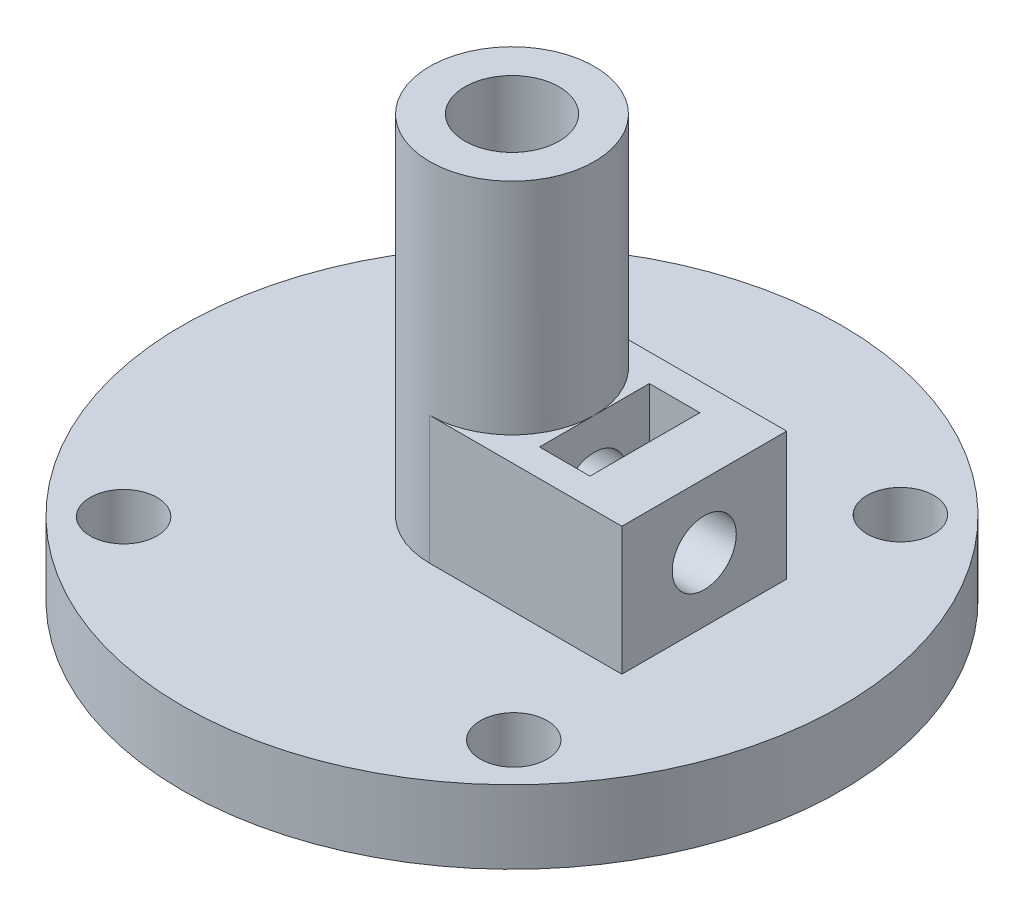
ISO-10303-21;
HEADER;
FILE_DESCRIPTION(('STEP AP214'),'2;1');
FILE_NAME('part.step','',(''),(''),'','','');
FILE_SCHEMA(('AUTOMOTIVE_DESIGN { 1 0 10303 214 1 1 1 1 }'));
ENDSEC;
DATA;
#1=APPLICATION_CONTEXT('core data for automotive mechanical design processes');
#2=APPLICATION_PROTOCOL_DEFINITION('international standard','automotive_design',2000,#1);
#3=PRODUCT_CONTEXT('',#1,'mechanical');
#4=PRODUCT('Part','Part','',(#3));
#5=PRODUCT_RELATED_PRODUCT_CATEGORY('part','',(#4));
#6=PRODUCT_DEFINITION_FORMATION('','',#4);
#7=PRODUCT_DEFINITION_CONTEXT('part definition',#1,'design');
#8=PRODUCT_DEFINITION('design','',#6,#7);
#9=PRODUCT_DEFINITION_SHAPE('','',#8);
#10=(LENGTH_UNIT() NAMED_UNIT(*) SI_UNIT(.MILLI.,.METRE.));
#11=(NAMED_UNIT(*) PLANE_ANGLE_UNIT() SI_UNIT($,.RADIAN.));
#12=(NAMED_UNIT(*) SI_UNIT($,.STERADIAN.) SOLID_ANGLE_UNIT());
#13=UNCERTAINTY_MEASURE_WITH_UNIT(LENGTH_MEASURE(1.E-05),#10,'distance_accuracy_value','');
#14=(GEOMETRIC_REPRESENTATION_CONTEXT(3) GLOBAL_UNCERTAINTY_ASSIGNED_CONTEXT((#13)) GLOBAL_UNIT_ASSIGNED_CONTEXT((#10,
#11,#12)) REPRESENTATION_CONTEXT('',''));
#15=CARTESIAN_POINT('',(0.,0.,0.));
#16=DIRECTION('',(0.,0.,1.));
#17=DIRECTION('',(1.,0.,0.));
#18=AXIS2_PLACEMENT_3D('',#15,#16,#17);
#19=CARTESIAN_POINT('',(0.,4.,0.));
#20=DIRECTION('',(0.,1.,0.));
#21=DIRECTION('',(0.,0.,1.));
#22=AXIS2_PLACEMENT_3D('',#19,#20,#21);
#23=PLANE('',#22);
#24=DIRECTION('',(0.,0.,1.));
#25=VECTOR('',#24,1.);
#26=CARTESIAN_POINT('',(10.5,4.,0.));
#27=LINE('',#26,#25);
#28=CARTESIAN_POINT('',(10.5,4.,-4.5));
#29=VERTEX_POINT('',#28);
#30=CARTESIAN_POINT('',(10.5,4.,4.5));
#31=VERTEX_POINT('',#30);
#32=EDGE_CURVE('E142',#29,#31,#27,.T.);
#33=ORIENTED_EDGE('',*,*,#32,.T.);
#34=DIRECTION('',(1.,0.,0.));
#35=VECTOR('',#34,1.);
#36=CARTESIAN_POINT('',(0.,4.,4.5));
#37=LINE('',#36,#35);
#38=CARTESIAN_POINT('',(0.,4.,4.5));
#39=VERTEX_POINT('',#38);
#40=EDGE_CURVE('E50',#39,#31,#37,.T.);
#41=ORIENTED_EDGE('',*,*,#40,.F.);
#42=CARTESIAN_POINT('',(0.,4.,0.));
#43=DIRECTION('',(0.,1.,0.));
#44=DIRECTION('',(0.,0.,1.));
#45=AXIS2_PLACEMENT_3D('',#42,#43,#44);
#46=CIRCLE('',#45,4.5);
#47=CARTESIAN_POINT('',(0.,4.,-4.5));
#48=VERTEX_POINT('',#47);
#49=EDGE_CURVE('E179',#48,#39,#46,.T.);
#50=ORIENTED_EDGE('',*,*,#49,.F.);
#51=DIRECTION('',(1.,0.,0.));
#52=VECTOR('',#51,1.);
#53=CARTESIAN_POINT('',(0.,4.,-4.5));
#54=LINE('',#53,#52);
#55=EDGE_CURVE('E57',#48,#29,#54,.T.);
#56=ORIENTED_EDGE('',*,*,#55,.T.);
#57=EDGE_LOOP('',(#33,#41,#50,#56));
#58=FACE_BOUND('',#57,.T.);
#59=CARTESIAN_POINT('',(-10.5589795718644,4.,10.6540110006021));
#60=DIRECTION('',(0.,1.,0.));
#61=DIRECTION('',(0.,0.,1.));
#62=AXIS2_PLACEMENT_3D('',#59,#60,#61);
#63=CIRCLE('',#62,1.825);
#64=CARTESIAN_POINT('',(-10.5589795718644,4.,12.4790110006021));
#65=VERTEX_POINT('',#64);
#66=EDGE_CURVE('E186',#65,#65,#63,.T.);
#67=ORIENTED_EDGE('',*,*,#66,.F.);
#68=EDGE_LOOP('',(#67));
#69=FACE_BOUND('',#68,.T.);
#70=CARTESIAN_POINT('',(10.6540110006025,4.,10.5589795718648));
#71=DIRECTION('',(0.,1.,0.));
#72=DIRECTION('',(0.,0.,1.));
#73=AXIS2_PLACEMENT_3D('',#70,#71,#72);
#74=CIRCLE('',#73,1.825);
#75=CARTESIAN_POINT('',(10.6540110006025,4.,12.3839795718648));
#76=VERTEX_POINT('',#75);
#77=EDGE_CURVE('E202',#76,#76,#74,.T.);
#78=ORIENTED_EDGE('',*,*,#77,.F.);
#79=EDGE_LOOP('',(#78));
#80=FACE_BOUND('',#79,.T.);
#81=CARTESIAN_POINT('',(10.5589795718652,4.,-10.6540110006021));
#82=DIRECTION('',(0.,1.,0.));
#83=DIRECTION('',(0.,0.,1.));
#84=AXIS2_PLACEMENT_3D('',#81,#82,#83);
#85=CIRCLE('',#84,1.825);
#86=CARTESIAN_POINT('',(10.5589795718652,4.,-8.8290110006021));
#87=VERTEX_POINT('',#86);
#88=EDGE_CURVE('E196',#87,#87,#85,.T.);
#89=ORIENTED_EDGE('',*,*,#88,.F.);
#90=EDGE_LOOP('',(#89));
#91=FACE_BOUND('',#90,.T.);
#92=CARTESIAN_POINT('',(-10.6540110006017,4.,-10.5589795718648));
#93=DIRECTION('',(0.,1.,0.));
#94=DIRECTION('',(0.,0.,1.));
#95=AXIS2_PLACEMENT_3D('',#92,#93,#94);
#96=CIRCLE('',#95,1.825);
#97=CARTESIAN_POINT('',(-10.6540110006017,4.,-8.73397957186481));
#98=VERTEX_POINT('',#97);
#99=EDGE_CURVE('E192',#98,#98,#96,.T.);
#100=ORIENTED_EDGE('',*,*,#99,.F.);
#101=EDGE_LOOP('',(#100));
#102=FACE_BOUND('',#101,.T.);
#103=CARTESIAN_POINT('',(0.,4.,0.));
#104=DIRECTION('',(0.,1.,0.));
#105=DIRECTION('',(0.,0.,1.));
#106=AXIS2_PLACEMENT_3D('',#103,#104,#105);
#107=CIRCLE('',#106,18.);
#108=CARTESIAN_POINT('',(0.,4.,18.));
#109=VERTEX_POINT('',#108);
#110=EDGE_CURVE('E11',#109,#109,#107,.T.);
#111=ORIENTED_EDGE('',*,*,#110,.T.);
#112=EDGE_LOOP('',(#111));
#113=FACE_BOUND('',#112,.T.);
#114=ADVANCED_FACE('F35',(#58,#69,#80,#91,#102,#113),#23,.T.);
#115=CARTESIAN_POINT('',(4.5,11.,0.));
#116=DIRECTION('',(-1.,0.,0.));
#117=DIRECTION('',(0.,0.,1.));
#118=AXIS2_PLACEMENT_3D('',#115,#116,#117);
#119=PLANE('',#118);
#120=CARTESIAN_POINT('',(4.5,7.5,0.));
#121=DIRECTION('',(-1.,0.,0.));
#122=DIRECTION('',(0.,0.,1.));
#123=AXIS2_PLACEMENT_3D('',#120,#121,#122);
#124=CIRCLE('',#123,1.75);
#125=CARTESIAN_POINT('',(4.5,7.5,1.75));
#126=VERTEX_POINT('',#125);
#127=EDGE_CURVE('E140',#126,#126,#124,.T.);
#128=ORIENTED_EDGE('',*,*,#127,.T.);
#129=EDGE_LOOP('',(#128));
#130=FACE_BOUND('',#129,.T.);
#131=DIRECTION('',(0.,0.,1.));
#132=VECTOR('',#131,1.);
#133=CARTESIAN_POINT('',(4.5,11.,0.));
#134=LINE('',#133,#132);
#135=CARTESIAN_POINT('',(4.5,11.,0.));
#136=VERTEX_POINT('',#135);
#137=CARTESIAN_POINT('',(4.5,11.,3.));
#138=VERTEX_POINT('',#137);
#139=EDGE_CURVE('E158',#136,#138,#134,.T.);
#140=ORIENTED_EDGE('',*,*,#139,.T.);
#141=DIRECTION('',(0.,-1.,0.));
#142=VECTOR('',#141,1.);
#143=CARTESIAN_POINT('',(4.5,11.,3.));
#144=LINE('',#143,#142);
#145=CARTESIAN_POINT('',(4.5,4.,3.));
#146=VERTEX_POINT('',#145);
#147=EDGE_CURVE('E115',#138,#146,#144,.T.);
#148=ORIENTED_EDGE('',*,*,#147,.T.);
#149=DIRECTION('',(0.,0.,-1.));
#150=VECTOR('',#149,1.);
#151=CARTESIAN_POINT('',(4.5,4.,0.));
#152=LINE('',#151,#150);
#153=CARTESIAN_POINT('',(4.5,4.,-3.));
#154=VERTEX_POINT('',#153);
#155=EDGE_CURVE('E163',#146,#154,#152,.T.);
#156=ORIENTED_EDGE('',*,*,#155,.T.);
#157=DIRECTION('',(0.,-1.,0.));
#158=VECTOR('',#157,1.);
#159=CARTESIAN_POINT('',(4.5,11.,-3.));
#160=LINE('',#159,#158);
#161=CARTESIAN_POINT('',(4.5,11.,-3.));
#162=VERTEX_POINT('',#161);
#163=EDGE_CURVE('E147',#162,#154,#160,.T.);
#164=ORIENTED_EDGE('',*,*,#163,.F.);
#165=DIRECTION('',(0.,0.,-1.));
#166=VECTOR('',#165,1.);
#167=CARTESIAN_POINT('',(4.5,11.,0.));
#168=LINE('',#167,#166);
#169=EDGE_CURVE('E169',#136,#162,#168,.T.);
#170=ORIENTED_EDGE('',*,*,#169,.F.);
#171=EDGE_LOOP('',(#140,#148,#156,#164,#170));
#172=FACE_BOUND('',#171,.T.);
#173=ADVANCED_FACE('F220',(#130,#172),#119,.F.);
#174=DIRECTION('',(1.,0.,0.));
#175=VECTOR('',#174,1.);
#176=CARTESIAN_POINT('',(0.,4.,3.));
#177=LINE('',#176,#175);
#178=CARTESIAN_POINT('',(7.26,4.,3.));
#179=VERTEX_POINT('',#178);
#180=EDGE_CURVE('E139',#146,#179,#177,.T.);
#181=ORIENTED_EDGE('',*,*,#180,.T.);
#182=DIRECTION('',(0.,0.,-1.));
#183=VECTOR('',#182,1.);
#184=CARTESIAN_POINT('',(7.26,4.,0.));
#185=LINE('',#184,#183);
#186=CARTESIAN_POINT('',(7.26,4.,-3.));
#187=VERTEX_POINT('',#186);
#188=EDGE_CURVE('E110',#179,#187,#185,.T.);
#189=ORIENTED_EDGE('',*,*,#188,.T.);
#190=DIRECTION('',(1.,0.,0.));
#191=VECTOR('',#190,1.);
#192=CARTESIAN_POINT('',(0.,4.,-3.));
#193=LINE('',#192,#191);
#194=EDGE_CURVE('E126',#154,#187,#193,.T.);
#195=ORIENTED_EDGE('',*,*,#194,.F.);
#196=ORIENTED_EDGE('',*,*,#155,.F.);
#197=EDGE_LOOP('',(#181,#189,#195,#196));
#198=FACE_BOUND('',#197,.T.);
#199=ADVANCED_FACE('F222',(#198),#23,.T.);
#200=CARTESIAN_POINT('',(0.,23.,0.));
#201=DIRECTION('',(0.,-1.,0.));
#202=DIRECTION('',(0.,0.,-1.));
#203=AXIS2_PLACEMENT_3D('',#200,#201,#202);
#204=CYLINDRICAL_SURFACE('',#203,4.5);
#205=CARTESIAN_POINT('',(0.,23.,0.));
#206=DIRECTION('',(0.,1.,0.));
#207=DIRECTION('',(0.,0.,1.));
#208=AXIS2_PLACEMENT_3D('',#205,#206,#207);
#209=CIRCLE('',#208,4.5);
#210=CARTESIAN_POINT('',(0.,23.,4.5));
#211=VERTEX_POINT('',#210);
#212=EDGE_CURVE('E183',#211,#211,#209,.T.);
#213=ORIENTED_EDGE('',*,*,#212,.F.);
#214=EDGE_LOOP('',(#213));
#215=FACE_BOUND('',#214,.T.);
#216=DIRECTION('',(0.,-1.,0.));
#217=VECTOR('',#216,1.);
#218=CARTESIAN_POINT('',(0.,11.,4.5));
#219=LINE('',#218,#217);
#220=CARTESIAN_POINT('',(0.,11.,4.5));
#221=VERTEX_POINT('',#220);
#222=EDGE_CURVE('E156',#221,#39,#219,.T.);
#223=ORIENTED_EDGE('',*,*,#222,.F.);
#224=CARTESIAN_POINT('',(0.,11.,0.));
#225=DIRECTION('',(0.,1.,0.));
#226=DIRECTION('',(0.,0.,1.));
#227=AXIS2_PLACEMENT_3D('',#224,#225,#226);
#228=CIRCLE('',#227,4.5);
#229=EDGE_CURVE('E114',#221,#136,#228,.T.);
#230=ORIENTED_EDGE('',*,*,#229,.T.);
#231=CARTESIAN_POINT('',(0.,11.,0.));
#232=DIRECTION('',(0.,1.,0.));
#233=DIRECTION('',(0.,0.,1.));
#234=AXIS2_PLACEMENT_3D('',#231,#232,#233);
#235=CIRCLE('',#234,4.5);
#236=CARTESIAN_POINT('',(0.,11.,-4.5));
#237=VERTEX_POINT('',#236);
#238=EDGE_CURVE('E166',#136,#237,#235,.T.);
#239=ORIENTED_EDGE('',*,*,#238,.T.);
#240=DIRECTION('',(0.,-1.,0.));
#241=VECTOR('',#240,1.);
#242=CARTESIAN_POINT('',(0.,11.,-4.5));
#243=LINE('',#242,#241);
#244=EDGE_CURVE('E173',#237,#48,#243,.T.);
#245=ORIENTED_EDGE('',*,*,#244,.T.);
#246=ORIENTED_EDGE('',*,*,#49,.T.);
#247=EDGE_LOOP('',(#223,#230,#239,#245,#246));
#248=FACE_BOUND('',#247,.T.);
#249=ADVANCED_FACE('F228',(#215,#248),#204,.T.);
#250=CARTESIAN_POINT('',(0.,4.,0.));
#251=DIRECTION('',(0.,-1.,0.));
#252=DIRECTION('',(0.,0.,-1.));
#253=AXIS2_PLACEMENT_3D('',#250,#251,#252);
#254=CYLINDRICAL_SURFACE('',#253,18.);
#255=ORIENTED_EDGE('',*,*,#110,.F.);
#256=EDGE_LOOP('',(#255));
#257=FACE_BOUND('',#256,.T.);
#258=CARTESIAN_POINT('',(0.,0.,0.));
#259=DIRECTION('',(0.,1.,0.));
#260=DIRECTION('',(0.,0.,1.));
#261=AXIS2_PLACEMENT_3D('',#258,#259,#260);
#262=CIRCLE('',#261,18.);
#263=CARTESIAN_POINT('',(0.,0.,18.));
#264=VERTEX_POINT('',#263);
#265=EDGE_CURVE('E39',#264,#264,#262,.T.);
#266=ORIENTED_EDGE('',*,*,#265,.T.);
#267=EDGE_LOOP('',(#266));
#268=FACE_BOUND('',#267,.T.);
#269=ADVANCED_FACE('F37',(#257,#268),#254,.T.);
#270=CARTESIAN_POINT('',(0.,0.,0.));
#271=DIRECTION('',(0.,1.,0.));
#272=DIRECTION('',(0.,0.,1.));
#273=AXIS2_PLACEMENT_3D('',#270,#271,#272);
#274=PLANE('',#273);
#275=CARTESIAN_POINT('',(-10.5589795718644,0.,10.6540110006021));
#276=DIRECTION('',(0.,1.,0.));
#277=DIRECTION('',(0.,0.,1.));
#278=AXIS2_PLACEMENT_3D('',#275,#276,#277);
#279=CIRCLE('',#278,1.825);
#280=CARTESIAN_POINT('',(-10.5589795718644,0.,12.4790110006021));
#281=VERTEX_POINT('',#280);
#282=EDGE_CURVE('E205',#281,#281,#279,.T.);
#283=ORIENTED_EDGE('',*,*,#282,.T.);
#284=EDGE_LOOP('',(#283));
#285=FACE_BOUND('',#284,.T.);
#286=CARTESIAN_POINT('',(10.6540110006025,0.,10.5589795718648));
#287=DIRECTION('',(0.,1.,0.));
#288=DIRECTION('',(0.,0.,1.));
#289=AXIS2_PLACEMENT_3D('',#286,#287,#288);
#290=CIRCLE('',#289,1.825);
#291=CARTESIAN_POINT('',(10.6540110006025,0.,12.3839795718648));
#292=VERTEX_POINT('',#291);
#293=EDGE_CURVE('E199',#292,#292,#290,.T.);
#294=ORIENTED_EDGE('',*,*,#293,.T.);
#295=EDGE_LOOP('',(#294));
#296=FACE_BOUND('',#295,.T.);
#297=CARTESIAN_POINT('',(10.5589795718652,0.,-10.6540110006021));
#298=DIRECTION('',(0.,1.,0.));
#299=DIRECTION('',(0.,0.,1.));
#300=AXIS2_PLACEMENT_3D('',#297,#298,#299);
#301=CIRCLE('',#300,1.825);
#302=CARTESIAN_POINT('',(10.5589795718652,0.,-8.8290110006021));
#303=VERTEX_POINT('',#302);
#304=EDGE_CURVE('E193',#303,#303,#301,.T.);
#305=ORIENTED_EDGE('',*,*,#304,.T.);
#306=EDGE_LOOP('',(#305));
#307=FACE_BOUND('',#306,.T.);
#308=CARTESIAN_POINT('',(0.,0.,0.));
#309=DIRECTION('',(0.,1.,0.));
#310=DIRECTION('',(0.,0.,1.));
#311=AXIS2_PLACEMENT_3D('',#308,#309,#310);
#312=CIRCLE('',#311,2.575);
#313=CARTESIAN_POINT('',(0.,0.,2.575));
#314=VERTEX_POINT('',#313);
#315=EDGE_CURVE('E189',#314,#314,#312,.T.);
#316=ORIENTED_EDGE('',*,*,#315,.T.);
#317=EDGE_LOOP('',(#316));
#318=FACE_BOUND('',#317,.T.);
#319=CARTESIAN_POINT('',(-10.6540110006017,0.,-10.5589795718648));
#320=DIRECTION('',(0.,1.,0.));
#321=DIRECTION('',(0.,0.,1.));
#322=AXIS2_PLACEMENT_3D('',#319,#320,#321);
#323=CIRCLE('',#322,1.825);
#324=CARTESIAN_POINT('',(-10.6540110006017,0.,-8.73397957186481));
#325=VERTEX_POINT('',#324);
#326=EDGE_CURVE('E210',#325,#325,#323,.T.);
#327=ORIENTED_EDGE('',*,*,#326,.T.);
#328=EDGE_LOOP('',(#327));
#329=FACE_BOUND('',#328,.T.);
#330=ORIENTED_EDGE('',*,*,#265,.F.);
#331=EDGE_LOOP('',(#330));
#332=FACE_BOUND('',#331,.T.);
#333=ADVANCED_FACE('F227',(#285,#296,#307,#318,#329,#332),#274,.F.);
#334=CARTESIAN_POINT('',(-10.6540110006017,0.,-10.5589795718648));
#335=DIRECTION('',(0.,1.,0.));
#336=DIRECTION('',(0.,0.,1.));
#337=AXIS2_PLACEMENT_3D('',#334,#335,#336);
#338=CYLINDRICAL_SURFACE('',#337,1.825);
#339=ORIENTED_EDGE('',*,*,#326,.F.);
#340=EDGE_LOOP('',(#339));
#341=FACE_BOUND('',#340,.T.);
#342=ORIENTED_EDGE('',*,*,#99,.T.);
#343=EDGE_LOOP('',(#342));
#344=FACE_BOUND('',#343,.T.);
#345=ADVANCED_FACE('F216',(#341,#344),#338,.F.);
#346=CARTESIAN_POINT('',(0.,0.,0.));
#347=DIRECTION('',(0.,1.,0.));
#348=DIRECTION('',(0.,0.,1.));
#349=AXIS2_PLACEMENT_3D('',#346,#347,#348);
#350=CYLINDRICAL_SURFACE('',#349,2.575);
#351=CARTESIAN_POINT('',(1.88894811998636,7.5,-1.75));
#352=CARTESIAN_POINT('',(1.88896127570853,7.584856709678,-1.74999274712449));
#353=CARTESIAN_POINT('',(1.89477888166079,7.66976946907564,-1.74376974898489));
#354=CARTESIAN_POINT('',(1.9168907510481,7.83651666979239,-1.71941873924017));
#355=CARTESIAN_POINT('',(1.93320743625965,7.91834412530091,-1.70126524716065));
#356=CARTESIAN_POINT('',(1.9733405005138,8.07594806823087,-1.65453324831505));
#357=CARTESIAN_POINT('',(1.99707886738419,8.15177766017081,-1.62606271413772));
#358=CARTESIAN_POINT('',(2.04924455399824,8.2974404852297,-1.55980714654182));
#359=CARTESIAN_POINT('',(2.07767255931395,8.36727283934737,-1.52202075084982));
#360=CARTESIAN_POINT('',(2.14155837532086,8.51142517081065,-1.43105544934505));
#361=CARTESIAN_POINT('',(2.17740689420404,8.5846225102066,-1.37637172249015));
#362=CARTESIAN_POINT('',(2.24888431100404,8.721793285141,-1.25620233890706));
#363=CARTESIAN_POINT('',(2.28451291547509,8.78575621984911,-1.19070456361891));
#364=CARTESIAN_POINT('',(2.35793782984972,8.91237329510512,-1.0387109468412));
#365=CARTESIAN_POINT('',(2.39523234477831,8.97333125914173,-0.950535701983107));
#366=CARTESIAN_POINT('',(2.46162635761846,9.07897548573598,-0.762188368863097));
#367=CARTESIAN_POINT('',(2.49074110044598,9.12369206408719,-0.662039100547952));
#368=CARTESIAN_POINT('',(2.53120719222669,9.1850110747363,-0.479572167163504));
#369=CARTESIAN_POINT('',(2.54519882924399,9.2058818700441,-0.399263846904382));
#370=CARTESIAN_POINT('',(2.56552356965098,9.23606284661888,-0.235572030673899));
#371=CARTESIAN_POINT('',(2.57186256836913,9.24538192707683,-0.152190952947602));
#372=CARTESIAN_POINT('',(2.57632070848884,9.25194434472185,0.0154102051474283));
#373=CARTESIAN_POINT('',(2.57442587446601,9.24916715067774,0.0996314697265288));
#374=CARTESIAN_POINT('',(2.56256104346585,9.23165668774806,0.26624475011632));
#375=CARTESIAN_POINT('',(2.55258868045458,9.21691991571357,0.348636222686357));
#376=CARTESIAN_POINT('',(2.52569283826932,9.17666864533112,0.507844230373744));
#377=CARTESIAN_POINT('',(2.50890125261763,9.15135840043403,0.58473566358223));
#378=CARTESIAN_POINT('',(2.4696462771837,9.09108442961262,0.7330520646118));
#379=CARTESIAN_POINT('',(2.44718180958288,9.05611886910948,0.804475990270121));
#380=CARTESIAN_POINT('',(2.39527949085475,8.97322828222293,0.948559980378887));
#381=CARTESIAN_POINT('',(2.36534104332483,8.92428676848122,1.02045199645255));
#382=CARTESIAN_POINT('',(2.30239584567868,8.81711208344035,1.15549201950931));
#383=CARTESIAN_POINT('',(2.26938557752197,8.75886820244495,1.21862978939408));
#384=CARTESIAN_POINT('',(2.19692230409728,8.62346082621249,1.34549208520136));
#385=CARTESIAN_POINT('',(2.15732522028314,8.54476374369659,1.4075039790277));
#386=CARTESIAN_POINT('',(2.08121595493411,8.37688432484707,1.51777698381026));
#387=CARTESIAN_POINT('',(2.04470212456889,8.28770765449184,1.56604547750068));
#388=CARTESIAN_POINT('',(1.98760509897062,8.12206153196546,1.63756856713269));
#389=CARTESIAN_POINT('',(1.96529708607844,8.04758507129091,1.66403994764414));
#390=CARTESIAN_POINT('',(1.9281803995822,7.89404491452536,1.70691437435249));
#391=CARTESIAN_POINT('',(1.91335798942852,7.81498991980656,1.72333587453045));
#392=CARTESIAN_POINT('',(1.89346559078333,7.65341770961466,1.74517886665378));
#393=CARTESIAN_POINT('',(1.88847723711403,7.57087727515565,1.75050830087774));
#394=CARTESIAN_POINT('',(1.88949013421689,7.40593956634669,1.74941491844563));
#395=CARTESIAN_POINT('',(1.89549139665116,7.32354229214876,1.74299208931814));
#396=CARTESIAN_POINT('',(1.91605268559687,7.17104537515994,1.7203357726196));
#397=CARTESIAN_POINT('',(1.92956225407731,7.10061253208657,1.70530049859642));
#398=CARTESIAN_POINT('',(1.9625532429715,6.9634050739091,1.66722629456956));
#399=CARTESIAN_POINT('',(1.98204019331772,6.89663391409746,1.64417995053959));
#400=CARTESIAN_POINT('',(2.03485990499653,6.73816892749182,1.57874496034542));
#401=CARTESIAN_POINT('',(2.07046501351936,6.6488956441029,1.53232393574432));
#402=CARTESIAN_POINT('',(2.14519604857245,6.48046322579824,1.42583458734813));
#403=CARTESIAN_POINT('',(2.18432843497217,6.40132331789943,1.36574090365419));
#404=CARTESIAN_POINT('',(2.26251912955272,6.25305231163275,1.23195962940916));
#405=CARTESIAN_POINT('',(2.30156857049436,6.18407851600816,1.15809187985337));
#406=CARTESIAN_POINT('',(2.37524835106887,6.05909059832307,0.998266984746064));
#407=CARTESIAN_POINT('',(2.40988560783285,6.00305607595752,0.912329217895766));
#408=CARTESIAN_POINT('',(2.46590519309217,5.91459375130406,0.745816834566028));
#409=CARTESIAN_POINT('',(2.48854721211368,5.87974781278443,0.666954432357997));
#410=CARTESIAN_POINT('',(2.52670592122509,5.8217276704924,0.50340279127018));
#411=CARTESIAN_POINT('',(2.54222717494875,5.79854599027833,0.418717324474745));
#412=CARTESIAN_POINT('',(2.5647891964473,5.76501453923742,0.245273557746356));
#413=CARTESIAN_POINT('',(2.57178869394483,5.75472720781939,0.156497581474676));
#414=CARTESIAN_POINT('',(2.57645019518249,5.74786465774686,-0.0218263374083529));
#415=CARTESIAN_POINT('',(2.57411424087477,5.7512864404853,-0.111374106929155));
#416=CARTESIAN_POINT('',(2.56092385254528,5.7707662815715,-0.280968853841053));
#417=CARTESIAN_POINT('',(2.55077719938799,5.78577470731537,-0.361196482829984));
#418=CARTESIAN_POINT('',(2.52367195619799,5.82637431714804,-0.517703835369135));
#419=CARTESIAN_POINT('',(2.50671195072722,5.85196770023861,-0.593982734872278));
#420=CARTESIAN_POINT('',(2.46623654336057,5.91419276444817,-0.744784747292465));
#421=CARTESIAN_POINT('',(2.44243410110383,5.95131529236429,-0.819026134813643));
#422=CARTESIAN_POINT('',(2.39038976373503,6.03476923015158,-0.960387672767943));
#423=CARTESIAN_POINT('',(2.3621467531301,6.08110295469662,-1.02750602674431));
#424=CARTESIAN_POINT('',(2.29833253496022,6.18986577707146,-1.16396653367807));
#425=CARTESIAN_POINT('',(2.26230788897281,6.25368067250453,-1.23199218041617));
#426=CARTESIAN_POINT('',(2.18956416918921,6.39118348791672,-1.35708781722424));
#427=CARTESIAN_POINT('',(2.15284371580352,6.46489329016526,-1.41413282322837));
#428=CARTESIAN_POINT('',(2.07744705756071,6.63170071684409,-1.52307703585116));
#429=CARTESIAN_POINT('',(2.03914943792948,6.72607323101295,-1.57331107412348));
#430=CARTESIAN_POINT('',(1.97227577761427,6.92521126456407,-1.65638975046769));
#431=CARTESIAN_POINT('',(1.94365756265067,7.02992905928079,-1.68931018359428));
#432=CARTESIAN_POINT('',(1.91220959979604,7.19705873441822,-1.72463080306645));
#433=CARTESIAN_POINT('',(1.90357146941668,7.25692542552748,-1.73410341263547));
#434=CARTESIAN_POINT('',(1.89193738079909,7.37785212935583,-1.74678908333303));
#435=CARTESIAN_POINT('',(1.88893864916428,7.43891154057161,-1.75000522135483));
#436=CARTESIAN_POINT('',(1.88894811998636,7.5,-1.75));
#437=B_SPLINE_CURVE_WITH_KNOTS('',3,(#351,#352,#353,#354,#355,#356,#357,#358,#359,#360,#361,
#362,#363,#364,#365,#366,#367,#368,#369,#370,#371,#372,#373,#374,#375,#376,#377,#378,#379,#380,
#381,#382,#383,#384,#385,#386,#387,#388,#389,#390,#391,#392,#393,#394,#395,#396,#397,#398,#399,
#400,#401,#402,#403,#404,#405,#406,#407,#408,#409,#410,#411,#412,#413,#414,#415,#416,#417,#418,
#419,#420,#421,#422,#423,#424,#425,#426,#427,#428,#429,#430,#431,#432,#433,#434,#435,#436),
.UNSPECIFIED.,.T.,.F.,(4,2,2,2,2,2,2,2,2,2,2,2,2,2,2,2,2,2,2,2,2,2,2,2,2,2,2,2,2,2,2,2,2,2,2,2,
2,2,2,2,2,2,4),(0.,0.25428193094091,0.50910871547543,0.761342197866413,1.0136125866661,
1.30698571882204,1.60068987372349,1.93931138777842,2.27729755045081,2.52864968585983,
2.77980806444173,3.03139290477063,3.28305146487522,3.53005830107874,3.77711210267495,
4.05201194640325,4.32723059095945,4.6490739777443,4.9707441478263,5.21622597379684,
5.46125567331366,5.70831099757502,5.95536658401016,6.17433832141078,6.39351325309881,
6.71202658444316,7.03113557777311,7.35475559905378,7.67786185709077,7.94417780979689,
8.21032284377365,8.47775173729071,8.74512213903575,8.99076168127207,9.23645228024048,
9.49451197376029,9.75263659703981,10.0514403979889,10.3509162277952,10.6898037272679,
11.0271950379103,11.2103430358244,11.3934009399147),.UNSPECIFIED.);
#438=CARTESIAN_POINT('',(1.88894811998636,7.5,-1.75));
#439=VERTEX_POINT('',#438);
#440=EDGE_CURVE('E263',#439,#439,#437,.T.);
#441=ORIENTED_EDGE('',*,*,#440,.T.);
#442=EDGE_LOOP('',(#441));
#443=FACE_BOUND('',#442,.T.);
#444=ORIENTED_EDGE('',*,*,#315,.F.);
#445=EDGE_LOOP('',(#444));
#446=FACE_BOUND('',#445,.T.);
#447=CARTESIAN_POINT('',(0.,23.,0.));
#448=DIRECTION('',(0.,1.,0.));
#449=DIRECTION('',(0.,0.,1.));
#450=AXIS2_PLACEMENT_3D('',#447,#448,#449);
#451=CIRCLE('',#450,2.575);
#452=CARTESIAN_POINT('',(0.,23.,2.575));
#453=VERTEX_POINT('',#452);
#454=EDGE_CURVE('E180',#453,#453,#451,.F.);
#455=ORIENTED_EDGE('',*,*,#454,.F.);
#456=EDGE_LOOP('',(#455));
#457=FACE_BOUND('',#456,.T.);
#458=ADVANCED_FACE('F237',(#443,#446,#457),#350,.F.);
#459=CARTESIAN_POINT('',(10.5589795718652,0.,-10.6540110006021));
#460=DIRECTION('',(0.,1.,0.));
#461=DIRECTION('',(0.,0.,1.));
#462=AXIS2_PLACEMENT_3D('',#459,#460,#461);
#463=CYLINDRICAL_SURFACE('',#462,1.825);
#464=ORIENTED_EDGE('',*,*,#304,.F.);
#465=EDGE_LOOP('',(#464));
#466=FACE_BOUND('',#465,.T.);
#467=ORIENTED_EDGE('',*,*,#88,.T.);
#468=EDGE_LOOP('',(#467));
#469=FACE_BOUND('',#468,.T.);
#470=ADVANCED_FACE('F252',(#466,#469),#463,.F.);
#471=CARTESIAN_POINT('',(10.6540110006025,0.,10.5589795718648));
#472=DIRECTION('',(0.,1.,0.));
#473=DIRECTION('',(0.,0.,1.));
#474=AXIS2_PLACEMENT_3D('',#471,#472,#473);
#475=CYLINDRICAL_SURFACE('',#474,1.825);
#476=ORIENTED_EDGE('',*,*,#293,.F.);
#477=EDGE_LOOP('',(#476));
#478=FACE_BOUND('',#477,.T.);
#479=ORIENTED_EDGE('',*,*,#77,.T.);
#480=EDGE_LOOP('',(#479));
#481=FACE_BOUND('',#480,.T.);
#482=ADVANCED_FACE('F248',(#478,#481),#475,.F.);
#483=CARTESIAN_POINT('',(-10.5589795718644,0.,10.6540110006021));
#484=DIRECTION('',(0.,1.,0.));
#485=DIRECTION('',(0.,0.,1.));
#486=AXIS2_PLACEMENT_3D('',#483,#484,#485);
#487=CYLINDRICAL_SURFACE('',#486,1.825);
#488=ORIENTED_EDGE('',*,*,#282,.F.);
#489=EDGE_LOOP('',(#488));
#490=FACE_BOUND('',#489,.T.);
#491=ORIENTED_EDGE('',*,*,#66,.T.);
#492=EDGE_LOOP('',(#491));
#493=FACE_BOUND('',#492,.T.);
#494=ADVANCED_FACE('F244',(#490,#493),#487,.F.);
#495=CARTESIAN_POINT('',(0.,23.,0.));
#496=DIRECTION('',(0.,1.,0.));
#497=DIRECTION('',(0.,0.,1.));
#498=AXIS2_PLACEMENT_3D('',#495,#496,#497);
#499=PLANE('',#498);
#500=ORIENTED_EDGE('',*,*,#454,.T.);
#501=EDGE_LOOP('',(#500));
#502=FACE_BOUND('',#501,.T.);
#503=ORIENTED_EDGE('',*,*,#212,.T.);
#504=EDGE_LOOP('',(#503));
#505=FACE_BOUND('',#504,.T.);
#506=ADVANCED_FACE('F247',(#502,#505),#499,.T.);
#507=CARTESIAN_POINT('',(0.,11.,-4.5));
#508=DIRECTION('',(0.,0.,-1.));
#509=DIRECTION('',(-1.,0.,0.));
#510=AXIS2_PLACEMENT_3D('',#507,#508,#509);
#511=PLANE('',#510);
#512=ORIENTED_EDGE('',*,*,#55,.F.);
#513=ORIENTED_EDGE('',*,*,#244,.F.);
#514=DIRECTION('',(1.,0.,0.));
#515=VECTOR('',#514,1.);
#516=CARTESIAN_POINT('',(0.,11.,-4.5));
#517=LINE('',#516,#515);
#518=CARTESIAN_POINT('',(10.5,11.,-4.5));
#519=VERTEX_POINT('',#518);
#520=EDGE_CURVE('E171',#237,#519,#517,.T.);
#521=ORIENTED_EDGE('',*,*,#520,.T.);
#522=DIRECTION('',(0.,-1.,0.));
#523=VECTOR('',#522,1.);
#524=CARTESIAN_POINT('',(10.5,11.,-4.5));
#525=LINE('',#524,#523);
#526=EDGE_CURVE('E150',#519,#29,#525,.T.);
#527=ORIENTED_EDGE('',*,*,#526,.T.);
#528=EDGE_LOOP('',(#512,#513,#521,#527));
#529=FACE_BOUND('',#528,.T.);
#530=ADVANCED_FACE('F296',(#529),#511,.T.);
#531=CARTESIAN_POINT('',(0.,11.,0.));
#532=DIRECTION('',(0.,1.,0.));
#533=DIRECTION('',(0.,0.,1.));
#534=AXIS2_PLACEMENT_3D('',#531,#532,#533);
#535=PLANE('',#534);
#536=ORIENTED_EDGE('',*,*,#238,.F.);
#537=ORIENTED_EDGE('',*,*,#169,.T.);
#538=DIRECTION('',(1.,0.,0.));
#539=VECTOR('',#538,1.);
#540=CARTESIAN_POINT('',(0.,11.,-3.));
#541=LINE('',#540,#539);
#542=CARTESIAN_POINT('',(7.26,11.,-3.));
#543=VERTEX_POINT('',#542);
#544=EDGE_CURVE('E124',#162,#543,#541,.T.);
#545=ORIENTED_EDGE('',*,*,#544,.T.);
#546=DIRECTION('',(0.,0.,-1.));
#547=VECTOR('',#546,1.);
#548=CARTESIAN_POINT('',(7.26,11.,0.));
#549=LINE('',#548,#547);
#550=CARTESIAN_POINT('',(7.26,11.,3.));
#551=VERTEX_POINT('',#550);
#552=EDGE_CURVE('E109',#551,#543,#549,.T.);
#553=ORIENTED_EDGE('',*,*,#552,.F.);
#554=DIRECTION('',(1.,0.,0.));
#555=VECTOR('',#554,1.);
#556=CARTESIAN_POINT('',(0.,11.,3.));
#557=LINE('',#556,#555);
#558=EDGE_CURVE('E121',#138,#551,#557,.T.);
#559=ORIENTED_EDGE('',*,*,#558,.F.);
#560=ORIENTED_EDGE('',*,*,#139,.F.);
#561=ORIENTED_EDGE('',*,*,#229,.F.);
#562=DIRECTION('',(1.,0.,0.));
#563=VECTOR('',#562,1.);
#564=CARTESIAN_POINT('',(0.,11.,4.5));
#565=LINE('',#564,#563);
#566=CARTESIAN_POINT('',(10.5,11.,4.5));
#567=VERTEX_POINT('',#566);
#568=EDGE_CURVE('E161',#221,#567,#565,.T.);
#569=ORIENTED_EDGE('',*,*,#568,.T.);
#570=DIRECTION('',(0.,0.,1.));
#571=VECTOR('',#570,1.);
#572=CARTESIAN_POINT('',(10.5,11.,0.));
#573=LINE('',#572,#571);
#574=EDGE_CURVE('E130',#519,#567,#573,.T.);
#575=ORIENTED_EDGE('',*,*,#574,.F.);
#576=ORIENTED_EDGE('',*,*,#520,.F.);
#577=EDGE_LOOP('',(#536,#537,#545,#553,#559,#560,#561,#569,#575,#576));
#578=FACE_BOUND('',#577,.T.);
#579=ADVANCED_FACE('F120',(#578),#535,.T.);
#580=CARTESIAN_POINT('',(0.,11.,4.5));
#581=DIRECTION('',(0.,0.,-1.));
#582=DIRECTION('',(-1.,0.,0.));
#583=AXIS2_PLACEMENT_3D('',#580,#581,#582);
#584=PLANE('',#583);
#585=ORIENTED_EDGE('',*,*,#40,.T.);
#586=DIRECTION('',(0.,-1.,0.));
#587=VECTOR('',#586,1.);
#588=CARTESIAN_POINT('',(10.5,11.,4.5));
#589=LINE('',#588,#587);
#590=EDGE_CURVE('E152',#567,#31,#589,.T.);
#591=ORIENTED_EDGE('',*,*,#590,.F.);
#592=ORIENTED_EDGE('',*,*,#568,.F.);
#593=ORIENTED_EDGE('',*,*,#222,.T.);
#594=EDGE_LOOP('',(#585,#591,#592,#593));
#595=FACE_BOUND('',#594,.T.);
#596=ADVANCED_FACE('F290',(#595),#584,.F.);
#597=CARTESIAN_POINT('',(7.26,11.,0.));
#598=DIRECTION('',(-1.,0.,0.));
#599=DIRECTION('',(0.,0.,1.));
#600=AXIS2_PLACEMENT_3D('',#597,#598,#599);
#601=PLANE('',#600);
#602=CARTESIAN_POINT('',(7.26,7.5,0.));
#603=DIRECTION('',(-1.,0.,0.));
#604=DIRECTION('',(0.,0.,1.));
#605=AXIS2_PLACEMENT_3D('',#602,#603,#604);
#606=CIRCLE('',#605,1.75);
#607=CARTESIAN_POINT('',(7.26,7.5,1.75));
#608=VERTEX_POINT('',#607);
#609=EDGE_CURVE('E270',#608,#608,#606,.T.);
#610=ORIENTED_EDGE('',*,*,#609,.F.);
#611=EDGE_LOOP('',(#610));
#612=FACE_BOUND('',#611,.T.);
#613=ORIENTED_EDGE('',*,*,#188,.F.);
#614=DIRECTION('',(0.,-1.,0.));
#615=VECTOR('',#614,1.);
#616=CARTESIAN_POINT('',(7.26,11.,3.));
#617=LINE('',#616,#615);
#618=EDGE_CURVE('E105',#551,#179,#617,.T.);
#619=ORIENTED_EDGE('',*,*,#618,.F.);
#620=ORIENTED_EDGE('',*,*,#552,.T.);
#621=DIRECTION('',(0.,-1.,0.));
#622=VECTOR('',#621,1.);
#623=CARTESIAN_POINT('',(7.26,11.,-3.));
#624=LINE('',#623,#622);
#625=EDGE_CURVE('E137',#543,#187,#624,.T.);
#626=ORIENTED_EDGE('',*,*,#625,.T.);
#627=EDGE_LOOP('',(#613,#619,#620,#626));
#628=FACE_BOUND('',#627,.T.);
#629=ADVANCED_FACE('F107',(#612,#628),#601,.T.);
#630=CARTESIAN_POINT('',(0.,11.,3.));
#631=DIRECTION('',(0.,0.,-1.));
#632=DIRECTION('',(-1.,0.,0.));
#633=AXIS2_PLACEMENT_3D('',#630,#631,#632);
#634=PLANE('',#633);
#635=ORIENTED_EDGE('',*,*,#180,.F.);
#636=ORIENTED_EDGE('',*,*,#147,.F.);
#637=ORIENTED_EDGE('',*,*,#558,.T.);
#638=ORIENTED_EDGE('',*,*,#618,.T.);
#639=EDGE_LOOP('',(#635,#636,#637,#638));
#640=FACE_BOUND('',#639,.T.);
#641=ADVANCED_FACE('F129',(#640),#634,.T.);
#642=CARTESIAN_POINT('',(10.5,11.,0.));
#643=DIRECTION('',(1.,0.,0.));
#644=DIRECTION('',(0.,0.,-1.));
#645=AXIS2_PLACEMENT_3D('',#642,#643,#644);
#646=PLANE('',#645);
#647=CARTESIAN_POINT('',(10.5,7.5,0.));
#648=DIRECTION('',(1.,0.,0.));
#649=DIRECTION('',(0.,0.,-1.));
#650=AXIS2_PLACEMENT_3D('',#647,#648,#649);
#651=CIRCLE('',#650,1.75);
#652=CARTESIAN_POINT('',(10.5,7.5,-1.75));
#653=VERTEX_POINT('',#652);
#654=EDGE_CURVE('E500',#653,#653,#651,.T.);
#655=ORIENTED_EDGE('',*,*,#654,.F.);
#656=EDGE_LOOP('',(#655));
#657=FACE_BOUND('',#656,.T.);
#658=ORIENTED_EDGE('',*,*,#32,.F.);
#659=ORIENTED_EDGE('',*,*,#526,.F.);
#660=ORIENTED_EDGE('',*,*,#574,.T.);
#661=ORIENTED_EDGE('',*,*,#590,.T.);
#662=EDGE_LOOP('',(#658,#659,#660,#661));
#663=FACE_BOUND('',#662,.T.);
#664=ADVANCED_FACE('F281',(#657,#663),#646,.T.);
#665=CARTESIAN_POINT('',(0.,11.,-3.));
#666=DIRECTION('',(0.,0.,-1.));
#667=DIRECTION('',(-1.,0.,0.));
#668=AXIS2_PLACEMENT_3D('',#665,#666,#667);
#669=PLANE('',#668);
#670=ORIENTED_EDGE('',*,*,#194,.T.);
#671=ORIENTED_EDGE('',*,*,#625,.F.);
#672=ORIENTED_EDGE('',*,*,#544,.F.);
#673=ORIENTED_EDGE('',*,*,#163,.T.);
#674=EDGE_LOOP('',(#670,#671,#672,#673));
#675=FACE_BOUND('',#674,.T.);
#676=ADVANCED_FACE('F277',(#675),#669,.F.);
#677=CARTESIAN_POINT('',(0.499999999999999,7.5,0.));
#678=DIRECTION('',(1.,0.,0.));
#679=DIRECTION('',(0.,0.,-1.));
#680=AXIS2_PLACEMENT_3D('',#677,#678,#679);
#681=CYLINDRICAL_SURFACE('',#680,1.75);
#682=ORIENTED_EDGE('',*,*,#609,.T.);
#683=EDGE_LOOP('',(#682));
#684=FACE_BOUND('',#683,.T.);
#685=ORIENTED_EDGE('',*,*,#654,.T.);
#686=EDGE_LOOP('',(#685));
#687=FACE_BOUND('',#686,.T.);
#688=ADVANCED_FACE('F272',(#684,#687),#681,.F.);
#689=ORIENTED_EDGE('',*,*,#440,.F.);
#690=EDGE_LOOP('',(#689));
#691=FACE_BOUND('',#690,.T.);
#692=ORIENTED_EDGE('',*,*,#127,.F.);
#693=EDGE_LOOP('',(#692));
#694=FACE_BOUND('',#693,.T.);
#695=ADVANCED_FACE('F276',(#691,#694),#681,.F.);
#696=CLOSED_SHELL('',(#114,#173,#199,#249,#269,#333,#345,#458,#470,#482,#494,#506,#530,#579,
#596,#629,#641,#664,#676,#688,#695));
#697=MANIFOLD_SOLID_BREP('B2',#696);
#698=ADVANCED_BREP_SHAPE_REPRESENTATION('',(#18,#697),#14);
#699=SHAPE_DEFINITION_REPRESENTATION(#9,#698);
ENDSEC;
END-ISO-10303-21;
